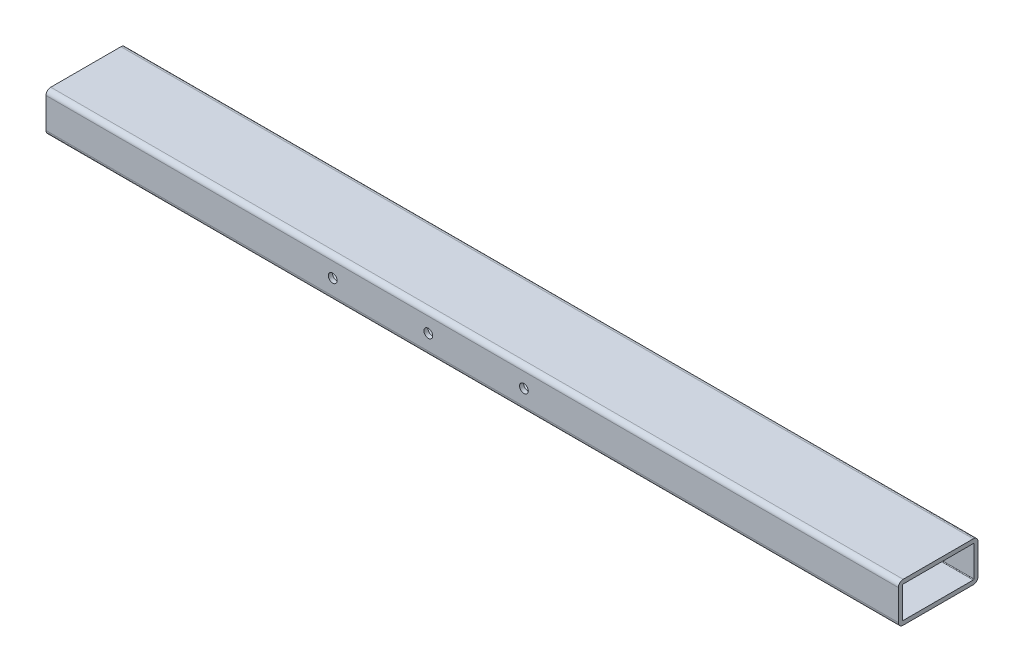
ISO-10303-21;
HEADER;
FILE_DESCRIPTION(('STEP AP214'),'2;1');
FILE_NAME('part.step','',(''),(''),'','','');
FILE_SCHEMA(('AUTOMOTIVE_DESIGN { 1 0 10303 214 1 1 1 1 }'));
ENDSEC;
DATA;
#1=APPLICATION_CONTEXT('core data for automotive mechanical design processes');
#2=APPLICATION_PROTOCOL_DEFINITION('international standard','automotive_design',2000,#1);
#3=PRODUCT_CONTEXT('',#1,'mechanical');
#4=PRODUCT('Part','Part','',(#3));
#5=PRODUCT_RELATED_PRODUCT_CATEGORY('part','',(#4));
#6=PRODUCT_DEFINITION_FORMATION('','',#4);
#7=PRODUCT_DEFINITION_CONTEXT('part definition',#1,'design');
#8=PRODUCT_DEFINITION('design','',#6,#7);
#9=PRODUCT_DEFINITION_SHAPE('','',#8);
#10=(LENGTH_UNIT() NAMED_UNIT(*) SI_UNIT(.MILLI.,.METRE.));
#11=(NAMED_UNIT(*) PLANE_ANGLE_UNIT() SI_UNIT($,.RADIAN.));
#12=(NAMED_UNIT(*) SI_UNIT($,.STERADIAN.) SOLID_ANGLE_UNIT());
#13=UNCERTAINTY_MEASURE_WITH_UNIT(LENGTH_MEASURE(1.E-05),#10,'distance_accuracy_value','');
#14=(GEOMETRIC_REPRESENTATION_CONTEXT(3) GLOBAL_UNCERTAINTY_ASSIGNED_CONTEXT((#13)) GLOBAL_UNIT_ASSIGNED_CONTEXT((#10,
#11,#12)) REPRESENTATION_CONTEXT('',''));
#15=CARTESIAN_POINT('',(0.,0.,0.));
#16=DIRECTION('',(0.,0.,1.));
#17=DIRECTION('',(1.,0.,0.));
#18=AXIS2_PLACEMENT_3D('',#15,#16,#17);
#19=CARTESIAN_POINT('',(535.,9.5,22.));
#20=DIRECTION('',(-1.,0.,0.));
#21=DIRECTION('',(0.,0.,1.));
#22=AXIS2_PLACEMENT_3D('',#19,#20,#21);
#23=CYLINDRICAL_SURFACE('',#22,3.);
#24=CARTESIAN_POINT('',(0.,9.5,22.));
#25=DIRECTION('',(1.,0.,0.));
#26=DIRECTION('',(0.,0.,-1.));
#27=AXIS2_PLACEMENT_3D('',#24,#25,#26);
#28=CIRCLE('',#27,3.);
#29=CARTESIAN_POINT('',(0.,12.5,22.));
#30=VERTEX_POINT('',#29);
#31=CARTESIAN_POINT('',(0.,9.5,25.));
#32=VERTEX_POINT('',#31);
#33=EDGE_CURVE('E242',#30,#32,#28,.T.);
#34=ORIENTED_EDGE('',*,*,#33,.T.);
#35=DIRECTION('',(-1.,0.,0.));
#36=VECTOR('',#35,1.);
#37=CARTESIAN_POINT('',(535.,9.5,25.));
#38=LINE('',#37,#36);
#39=CARTESIAN_POINT('',(535.,9.5,25.));
#40=VERTEX_POINT('',#39);
#41=EDGE_CURVE('E12',#40,#32,#38,.T.);
#42=ORIENTED_EDGE('',*,*,#41,.F.);
#43=CARTESIAN_POINT('',(535.,9.5,22.));
#44=DIRECTION('',(1.,0.,0.));
#45=DIRECTION('',(0.,0.,-1.));
#46=AXIS2_PLACEMENT_3D('',#43,#44,#45);
#47=CIRCLE('',#46,3.);
#48=CARTESIAN_POINT('',(535.,12.5,22.));
#49=VERTEX_POINT('',#48);
#50=EDGE_CURVE('E326',#49,#40,#47,.T.);
#51=ORIENTED_EDGE('',*,*,#50,.F.);
#52=DIRECTION('',(-1.,0.,0.));
#53=VECTOR('',#52,1.);
#54=CARTESIAN_POINT('',(535.,12.5,22.));
#55=LINE('',#54,#53);
#56=EDGE_CURVE('E257',#49,#30,#55,.T.);
#57=ORIENTED_EDGE('',*,*,#56,.T.);
#58=EDGE_LOOP('',(#34,#42,#51,#57));
#59=FACE_BOUND('',#58,.T.);
#60=ADVANCED_FACE('F68',(#59),#23,.T.);
#61=CARTESIAN_POINT('',(535.,9.5,25.));
#62=DIRECTION('',(0.,0.,-1.));
#63=DIRECTION('',(-1.,0.,0.));
#64=AXIS2_PLACEMENT_3D('',#61,#62,#63);
#65=PLANE('',#64);
#66=CARTESIAN_POINT('',(179.973841654525,0.200000000000009,25.));
#67=DIRECTION('',(0.,0.,-1.));
#68=DIRECTION('',(-1.,0.,0.));
#69=AXIS2_PLACEMENT_3D('',#66,#67,#68);
#70=CIRCLE('',#69,2.75000000000001);
#71=CARTESIAN_POINT('',(177.223841654525,0.200000000000009,25.));
#72=VERTEX_POINT('',#71);
#73=EDGE_CURVE('E286',#72,#72,#70,.T.);
#74=ORIENTED_EDGE('',*,*,#73,.T.);
#75=EDGE_LOOP('',(#74));
#76=FACE_BOUND('',#75,.T.);
#77=CARTESIAN_POINT('',(239.973841654525,0.200000000000006,25.));
#78=DIRECTION('',(0.,0.,-1.));
#79=DIRECTION('',(-1.,0.,0.));
#80=AXIS2_PLACEMENT_3D('',#77,#78,#79);
#81=CIRCLE('',#80,2.75000000000001);
#82=CARTESIAN_POINT('',(237.223841654525,0.200000000000006,25.));
#83=VERTEX_POINT('',#82);
#84=EDGE_CURVE('E460',#83,#83,#81,.T.);
#85=ORIENTED_EDGE('',*,*,#84,.T.);
#86=EDGE_LOOP('',(#85));
#87=FACE_BOUND('',#86,.T.);
#88=CARTESIAN_POINT('',(299.973841654525,0.199999999999997,25.));
#89=DIRECTION('',(0.,0.,-1.));
#90=DIRECTION('',(-1.,0.,0.));
#91=AXIS2_PLACEMENT_3D('',#88,#89,#90);
#92=CIRCLE('',#91,2.74999999999998);
#93=CARTESIAN_POINT('',(297.223841654525,0.199999999999997,25.));
#94=VERTEX_POINT('',#93);
#95=EDGE_CURVE('E299',#94,#94,#92,.T.);
#96=ORIENTED_EDGE('',*,*,#95,.T.);
#97=EDGE_LOOP('',(#96));
#98=FACE_BOUND('',#97,.T.);
#99=DIRECTION('',(0.,-1.,0.));
#100=VECTOR('',#99,1.);
#101=CARTESIAN_POINT('',(0.,9.5,25.));
#102=LINE('',#101,#100);
#103=CARTESIAN_POINT('',(0.,-9.5,25.));
#104=VERTEX_POINT('',#103);
#105=EDGE_CURVE('E245',#32,#104,#102,.T.);
#106=ORIENTED_EDGE('',*,*,#105,.T.);
#107=DIRECTION('',(-1.,0.,0.));
#108=VECTOR('',#107,1.);
#109=CARTESIAN_POINT('',(535.,-9.5,25.));
#110=LINE('',#109,#108);
#111=CARTESIAN_POINT('',(535.,-9.5,25.));
#112=VERTEX_POINT('',#111);
#113=EDGE_CURVE('E78',#112,#104,#110,.T.);
#114=ORIENTED_EDGE('',*,*,#113,.F.);
#115=DIRECTION('',(0.,-1.,0.));
#116=VECTOR('',#115,1.);
#117=CARTESIAN_POINT('',(535.,9.5,25.));
#118=LINE('',#117,#116);
#119=EDGE_CURVE('E328',#40,#112,#118,.T.);
#120=ORIENTED_EDGE('',*,*,#119,.F.);
#121=ORIENTED_EDGE('',*,*,#41,.T.);
#122=EDGE_LOOP('',(#106,#114,#120,#121));
#123=FACE_BOUND('',#122,.T.);
#124=ADVANCED_FACE('F366',(#76,#87,#98,#123),#65,.F.);
#125=CARTESIAN_POINT('',(535.,-9.5,22.));
#126=DIRECTION('',(-1.,0.,0.));
#127=DIRECTION('',(0.,0.,1.));
#128=AXIS2_PLACEMENT_3D('',#125,#126,#127);
#129=CYLINDRICAL_SURFACE('',#128,3.);
#130=CARTESIAN_POINT('',(0.,-9.5,22.));
#131=DIRECTION('',(1.,0.,0.));
#132=DIRECTION('',(0.,0.,-1.));
#133=AXIS2_PLACEMENT_3D('',#130,#131,#132);
#134=CIRCLE('',#133,3.);
#135=CARTESIAN_POINT('',(0.,-12.5,22.));
#136=VERTEX_POINT('',#135);
#137=EDGE_CURVE('E247',#104,#136,#134,.T.);
#138=ORIENTED_EDGE('',*,*,#137,.T.);
#139=DIRECTION('',(-1.,0.,0.));
#140=VECTOR('',#139,1.);
#141=CARTESIAN_POINT('',(535.,-12.5,22.));
#142=LINE('',#141,#140);
#143=CARTESIAN_POINT('',(535.,-12.5,22.));
#144=VERTEX_POINT('',#143);
#145=EDGE_CURVE('E264',#144,#136,#142,.T.);
#146=ORIENTED_EDGE('',*,*,#145,.F.);
#147=CARTESIAN_POINT('',(535.,-9.5,22.));
#148=DIRECTION('',(1.,0.,0.));
#149=DIRECTION('',(0.,0.,-1.));
#150=AXIS2_PLACEMENT_3D('',#147,#148,#149);
#151=CIRCLE('',#150,3.);
#152=EDGE_CURVE('E330',#112,#144,#151,.T.);
#153=ORIENTED_EDGE('',*,*,#152,.F.);
#154=ORIENTED_EDGE('',*,*,#113,.T.);
#155=EDGE_LOOP('',(#138,#146,#153,#154));
#156=FACE_BOUND('',#155,.T.);
#157=ADVANCED_FACE('F371',(#156),#129,.T.);
#158=CARTESIAN_POINT('',(535.,-12.5,-22.));
#159=DIRECTION('',(0.,1.,0.));
#160=DIRECTION('',(0.,0.,1.));
#161=AXIS2_PLACEMENT_3D('',#158,#159,#160);
#162=PLANE('',#161);
#163=DIRECTION('',(0.,0.,-1.));
#164=VECTOR('',#163,1.);
#165=CARTESIAN_POINT('',(0.,-12.5,-22.));
#166=LINE('',#165,#164);
#167=CARTESIAN_POINT('',(0.,-12.5,-22.));
#168=VERTEX_POINT('',#167);
#169=EDGE_CURVE('E249',#136,#168,#166,.T.);
#170=ORIENTED_EDGE('',*,*,#169,.T.);
#171=DIRECTION('',(-1.,0.,0.));
#172=VECTOR('',#171,1.);
#173=CARTESIAN_POINT('',(535.,-12.5,-22.));
#174=LINE('',#173,#172);
#175=CARTESIAN_POINT('',(535.,-12.5,-22.));
#176=VERTEX_POINT('',#175);
#177=EDGE_CURVE('E261',#176,#168,#174,.T.);
#178=ORIENTED_EDGE('',*,*,#177,.F.);
#179=DIRECTION('',(0.,0.,-1.));
#180=VECTOR('',#179,1.);
#181=CARTESIAN_POINT('',(535.,-12.5,-22.));
#182=LINE('',#181,#180);
#183=EDGE_CURVE('E332',#144,#176,#182,.T.);
#184=ORIENTED_EDGE('',*,*,#183,.F.);
#185=ORIENTED_EDGE('',*,*,#145,.T.);
#186=EDGE_LOOP('',(#170,#178,#184,#185));
#187=FACE_BOUND('',#186,.T.);
#188=ADVANCED_FACE('F338',(#187),#162,.F.);
#189=CARTESIAN_POINT('',(535.,-9.5,-22.));
#190=DIRECTION('',(-1.,0.,0.));
#191=DIRECTION('',(0.,0.,1.));
#192=AXIS2_PLACEMENT_3D('',#189,#190,#191);
#193=CYLINDRICAL_SURFACE('',#192,3.);
#194=CARTESIAN_POINT('',(0.,-9.5,-22.));
#195=DIRECTION('',(1.,0.,0.));
#196=DIRECTION('',(0.,0.,-1.));
#197=AXIS2_PLACEMENT_3D('',#194,#195,#196);
#198=CIRCLE('',#197,3.);
#199=CARTESIAN_POINT('',(0.,-9.5,-25.));
#200=VERTEX_POINT('',#199);
#201=EDGE_CURVE('E251',#168,#200,#198,.T.);
#202=ORIENTED_EDGE('',*,*,#201,.T.);
#203=DIRECTION('',(-1.,0.,0.));
#204=VECTOR('',#203,1.);
#205=CARTESIAN_POINT('',(535.,-9.5,-25.));
#206=LINE('',#205,#204);
#207=CARTESIAN_POINT('',(535.,-9.5,-25.));
#208=VERTEX_POINT('',#207);
#209=EDGE_CURVE('E208',#208,#200,#206,.T.);
#210=ORIENTED_EDGE('',*,*,#209,.F.);
#211=CARTESIAN_POINT('',(535.,-9.5,-22.));
#212=DIRECTION('',(1.,0.,0.));
#213=DIRECTION('',(0.,0.,-1.));
#214=AXIS2_PLACEMENT_3D('',#211,#212,#213);
#215=CIRCLE('',#214,3.);
#216=EDGE_CURVE('E199',#176,#208,#215,.T.);
#217=ORIENTED_EDGE('',*,*,#216,.F.);
#218=ORIENTED_EDGE('',*,*,#177,.T.);
#219=EDGE_LOOP('',(#202,#210,#217,#218));
#220=FACE_BOUND('',#219,.T.);
#221=ADVANCED_FACE('F342',(#220),#193,.T.);
#222=CARTESIAN_POINT('',(535.,-9.5,-25.));
#223=DIRECTION('',(0.,0.,1.));
#224=DIRECTION('',(1.,0.,0.));
#225=AXIS2_PLACEMENT_3D('',#222,#223,#224);
#226=PLANE('',#225);
#227=CARTESIAN_POINT('',(179.973841654525,0.200000000000009,-25.));
#228=DIRECTION('',(0.,0.,-1.));
#229=DIRECTION('',(-1.,0.,0.));
#230=AXIS2_PLACEMENT_3D('',#227,#228,#229);
#231=CIRCLE('',#230,2.75000000000001);
#232=CARTESIAN_POINT('',(177.223841654525,0.200000000000009,-25.));
#233=VERTEX_POINT('',#232);
#234=EDGE_CURVE('E452',#233,#233,#231,.T.);
#235=ORIENTED_EDGE('',*,*,#234,.F.);
#236=EDGE_LOOP('',(#235));
#237=FACE_BOUND('',#236,.T.);
#238=CARTESIAN_POINT('',(239.973841654525,0.200000000000006,-25.));
#239=DIRECTION('',(0.,0.,-1.));
#240=DIRECTION('',(-1.,0.,0.));
#241=AXIS2_PLACEMENT_3D('',#238,#239,#240);
#242=CIRCLE('',#241,2.75000000000001);
#243=CARTESIAN_POINT('',(237.223841654525,0.200000000000006,-25.));
#244=VERTEX_POINT('',#243);
#245=EDGE_CURVE('E455',#244,#244,#242,.T.);
#246=ORIENTED_EDGE('',*,*,#245,.F.);
#247=EDGE_LOOP('',(#246));
#248=FACE_BOUND('',#247,.T.);
#249=CARTESIAN_POINT('',(299.973841654525,0.199999999999997,-25.));
#250=DIRECTION('',(0.,0.,-1.));
#251=DIRECTION('',(-1.,0.,0.));
#252=AXIS2_PLACEMENT_3D('',#249,#250,#251);
#253=CIRCLE('',#252,2.74999999999998);
#254=CARTESIAN_POINT('',(297.223841654525,0.199999999999997,-25.));
#255=VERTEX_POINT('',#254);
#256=EDGE_CURVE('E462',#255,#255,#253,.T.);
#257=ORIENTED_EDGE('',*,*,#256,.F.);
#258=EDGE_LOOP('',(#257));
#259=FACE_BOUND('',#258,.T.);
#260=DIRECTION('',(0.,1.,0.));
#261=VECTOR('',#260,1.);
#262=CARTESIAN_POINT('',(0.,-9.5,-25.));
#263=LINE('',#262,#261);
#264=CARTESIAN_POINT('',(0.,9.5,-25.));
#265=VERTEX_POINT('',#264);
#266=EDGE_CURVE('E207',#200,#265,#263,.T.);
#267=ORIENTED_EDGE('',*,*,#266,.T.);
#268=DIRECTION('',(-1.,0.,0.));
#269=VECTOR('',#268,1.);
#270=CARTESIAN_POINT('',(535.,9.5,-25.));
#271=LINE('',#270,#269);
#272=CARTESIAN_POINT('',(535.,9.5,-25.));
#273=VERTEX_POINT('',#272);
#274=EDGE_CURVE('E204',#273,#265,#271,.T.);
#275=ORIENTED_EDGE('',*,*,#274,.F.);
#276=DIRECTION('',(0.,1.,0.));
#277=VECTOR('',#276,1.);
#278=CARTESIAN_POINT('',(535.,-9.5,-25.));
#279=LINE('',#278,#277);
#280=EDGE_CURVE('E193',#208,#273,#279,.T.);
#281=ORIENTED_EDGE('',*,*,#280,.F.);
#282=ORIENTED_EDGE('',*,*,#209,.T.);
#283=EDGE_LOOP('',(#267,#275,#281,#282));
#284=FACE_BOUND('',#283,.T.);
#285=ADVANCED_FACE('F205',(#237,#248,#259,#284),#226,.F.);
#286=CARTESIAN_POINT('',(535.,9.5,-22.));
#287=DIRECTION('',(-1.,0.,0.));
#288=DIRECTION('',(0.,0.,1.));
#289=AXIS2_PLACEMENT_3D('',#286,#287,#288);
#290=CYLINDRICAL_SURFACE('',#289,3.);
#291=CARTESIAN_POINT('',(0.,9.5,-22.));
#292=DIRECTION('',(1.,0.,0.));
#293=DIRECTION('',(0.,0.,-1.));
#294=AXIS2_PLACEMENT_3D('',#291,#292,#293);
#295=CIRCLE('',#294,3.);
#296=CARTESIAN_POINT('',(0.,12.5,-22.));
#297=VERTEX_POINT('',#296);
#298=EDGE_CURVE('E140',#265,#297,#295,.T.);
#299=ORIENTED_EDGE('',*,*,#298,.T.);
#300=DIRECTION('',(-1.,0.,0.));
#301=VECTOR('',#300,1.);
#302=CARTESIAN_POINT('',(535.,12.5,-22.));
#303=LINE('',#302,#301);
#304=CARTESIAN_POINT('',(535.,12.5,-22.));
#305=VERTEX_POINT('',#304);
#306=EDGE_CURVE('E209',#305,#297,#303,.T.);
#307=ORIENTED_EDGE('',*,*,#306,.F.);
#308=CARTESIAN_POINT('',(535.,9.5,-22.));
#309=DIRECTION('',(1.,0.,0.));
#310=DIRECTION('',(0.,0.,-1.));
#311=AXIS2_PLACEMENT_3D('',#308,#309,#310);
#312=CIRCLE('',#311,3.);
#313=EDGE_CURVE('E197',#273,#305,#312,.T.);
#314=ORIENTED_EDGE('',*,*,#313,.F.);
#315=ORIENTED_EDGE('',*,*,#274,.T.);
#316=EDGE_LOOP('',(#299,#307,#314,#315));
#317=FACE_BOUND('',#316,.T.);
#318=ADVANCED_FACE('F211',(#317),#290,.T.);
#319=CARTESIAN_POINT('',(535.,-9.5,22.));
#320=DIRECTION('',(-1.,0.,0.));
#321=DIRECTION('',(0.,0.,1.));
#322=AXIS2_PLACEMENT_3D('',#319,#320,#321);
#323=CYLINDRICAL_SURFACE('',#322,0.4);
#324=CARTESIAN_POINT('',(0.,-9.5,22.));
#325=DIRECTION('',(1.,0.,0.));
#326=DIRECTION('',(0.,0.,-1.));
#327=AXIS2_PLACEMENT_3D('',#324,#325,#326);
#328=CIRCLE('',#327,0.4);
#329=CARTESIAN_POINT('',(0.,-9.5,22.4));
#330=VERTEX_POINT('',#329);
#331=CARTESIAN_POINT('',(0.,-9.9,22.));
#332=VERTEX_POINT('',#331);
#333=EDGE_CURVE('E217',#330,#332,#328,.T.);
#334=ORIENTED_EDGE('',*,*,#333,.F.);
#335=DIRECTION('',(-1.,0.,0.));
#336=VECTOR('',#335,1.);
#337=CARTESIAN_POINT('',(535.,-9.5,22.4));
#338=LINE('',#337,#336);
#339=CARTESIAN_POINT('',(535.,-9.5,22.4));
#340=VERTEX_POINT('',#339);
#341=EDGE_CURVE('E154',#340,#330,#338,.T.);
#342=ORIENTED_EDGE('',*,*,#341,.F.);
#343=CARTESIAN_POINT('',(535.,-9.5,22.));
#344=DIRECTION('',(1.,0.,0.));
#345=DIRECTION('',(0.,0.,-1.));
#346=AXIS2_PLACEMENT_3D('',#343,#344,#345);
#347=CIRCLE('',#346,0.4);
#348=CARTESIAN_POINT('',(535.,-9.9,22.));
#349=VERTEX_POINT('',#348);
#350=EDGE_CURVE('E256',#340,#349,#347,.T.);
#351=ORIENTED_EDGE('',*,*,#350,.T.);
#352=DIRECTION('',(-1.,0.,0.));
#353=VECTOR('',#352,1.);
#354=CARTESIAN_POINT('',(535.,-9.9,22.));
#355=LINE('',#354,#353);
#356=EDGE_CURVE('E213',#349,#332,#355,.T.);
#357=ORIENTED_EDGE('',*,*,#356,.T.);
#358=EDGE_LOOP('',(#334,#342,#351,#357));
#359=FACE_BOUND('',#358,.T.);
#360=ADVANCED_FACE('F70',(#359),#323,.F.);
#361=CARTESIAN_POINT('',(535.,9.5,22.4));
#362=DIRECTION('',(0.,0.,-1.));
#363=DIRECTION('',(-1.,0.,0.));
#364=AXIS2_PLACEMENT_3D('',#361,#362,#363);
#365=PLANE('',#364);
#366=CARTESIAN_POINT('',(179.973841654525,0.200000000000009,22.4));
#367=DIRECTION('',(0.,0.,-1.));
#368=DIRECTION('',(-1.,0.,0.));
#369=AXIS2_PLACEMENT_3D('',#366,#367,#368);
#370=CIRCLE('',#369,2.75000000000001);
#371=CARTESIAN_POINT('',(177.223841654525,0.200000000000009,22.4));
#372=VERTEX_POINT('',#371);
#373=EDGE_CURVE('E221',#372,#372,#370,.T.);
#374=ORIENTED_EDGE('',*,*,#373,.F.);
#375=EDGE_LOOP('',(#374));
#376=FACE_BOUND('',#375,.T.);
#377=CARTESIAN_POINT('',(239.973841654525,0.200000000000006,22.4));
#378=DIRECTION('',(0.,0.,-1.));
#379=DIRECTION('',(-1.,0.,0.));
#380=AXIS2_PLACEMENT_3D('',#377,#378,#379);
#381=CIRCLE('',#380,2.75000000000001);
#382=CARTESIAN_POINT('',(237.223841654525,0.200000000000006,22.4));
#383=VERTEX_POINT('',#382);
#384=EDGE_CURVE('E289',#383,#383,#381,.T.);
#385=ORIENTED_EDGE('',*,*,#384,.F.);
#386=EDGE_LOOP('',(#385));
#387=FACE_BOUND('',#386,.T.);
#388=CARTESIAN_POINT('',(299.973841654525,0.199999999999997,22.4));
#389=DIRECTION('',(0.,0.,-1.));
#390=DIRECTION('',(-1.,0.,0.));
#391=AXIS2_PLACEMENT_3D('',#388,#389,#390);
#392=CIRCLE('',#391,2.74999999999998);
#393=CARTESIAN_POINT('',(297.223841654525,0.199999999999997,22.4));
#394=VERTEX_POINT('',#393);
#395=EDGE_CURVE('E285',#394,#394,#392,.T.);
#396=ORIENTED_EDGE('',*,*,#395,.F.);
#397=EDGE_LOOP('',(#396));
#398=FACE_BOUND('',#397,.T.);
#399=DIRECTION('',(0.,-1.,0.));
#400=VECTOR('',#399,1.);
#401=CARTESIAN_POINT('',(0.,9.5,22.4));
#402=LINE('',#401,#400);
#403=CARTESIAN_POINT('',(0.,9.5,22.4));
#404=VERTEX_POINT('',#403);
#405=EDGE_CURVE('E220',#404,#330,#402,.T.);
#406=ORIENTED_EDGE('',*,*,#405,.F.);
#407=DIRECTION('',(-1.,0.,0.));
#408=VECTOR('',#407,1.);
#409=CARTESIAN_POINT('',(535.,9.5,22.4));
#410=LINE('',#409,#408);
#411=CARTESIAN_POINT('',(535.,9.5,22.4));
#412=VERTEX_POINT('',#411);
#413=EDGE_CURVE('E280',#412,#404,#410,.T.);
#414=ORIENTED_EDGE('',*,*,#413,.F.);
#415=DIRECTION('',(0.,-1.,0.));
#416=VECTOR('',#415,1.);
#417=CARTESIAN_POINT('',(535.,9.5,22.4));
#418=LINE('',#417,#416);
#419=EDGE_CURVE('E305',#412,#340,#418,.T.);
#420=ORIENTED_EDGE('',*,*,#419,.T.);
#421=ORIENTED_EDGE('',*,*,#341,.T.);
#422=EDGE_LOOP('',(#406,#414,#420,#421));
#423=FACE_BOUND('',#422,.T.);
#424=ADVANCED_FACE('F393',(#376,#387,#398,#423),#365,.T.);
#425=CARTESIAN_POINT('',(535.,9.5,22.));
#426=DIRECTION('',(-1.,0.,0.));
#427=DIRECTION('',(0.,0.,1.));
#428=AXIS2_PLACEMENT_3D('',#425,#426,#427);
#429=CYLINDRICAL_SURFACE('',#428,0.4);
#430=CARTESIAN_POINT('',(0.,9.5,22.));
#431=DIRECTION('',(1.,0.,0.));
#432=DIRECTION('',(0.,0.,-1.));
#433=AXIS2_PLACEMENT_3D('',#430,#431,#432);
#434=CIRCLE('',#433,0.4);
#435=CARTESIAN_POINT('',(0.,9.9,22.));
#436=VERTEX_POINT('',#435);
#437=EDGE_CURVE('E224',#436,#404,#434,.T.);
#438=ORIENTED_EDGE('',*,*,#437,.F.);
#439=DIRECTION('',(-1.,0.,0.));
#440=VECTOR('',#439,1.);
#441=CARTESIAN_POINT('',(535.,9.9,22.));
#442=LINE('',#441,#440);
#443=CARTESIAN_POINT('',(535.,9.9,22.));
#444=VERTEX_POINT('',#443);
#445=EDGE_CURVE('E278',#444,#436,#442,.T.);
#446=ORIENTED_EDGE('',*,*,#445,.F.);
#447=CARTESIAN_POINT('',(535.,9.5,22.));
#448=DIRECTION('',(1.,0.,0.));
#449=DIRECTION('',(0.,0.,-1.));
#450=AXIS2_PLACEMENT_3D('',#447,#448,#449);
#451=CIRCLE('',#450,0.4);
#452=EDGE_CURVE('E308',#444,#412,#451,.T.);
#453=ORIENTED_EDGE('',*,*,#452,.T.);
#454=ORIENTED_EDGE('',*,*,#413,.T.);
#455=EDGE_LOOP('',(#438,#446,#453,#454));
#456=FACE_BOUND('',#455,.T.);
#457=ADVANCED_FACE('F390',(#456),#429,.F.);
#458=CARTESIAN_POINT('',(535.,9.9,22.));
#459=DIRECTION('',(0.,-1.,0.));
#460=DIRECTION('',(0.,0.,-1.));
#461=AXIS2_PLACEMENT_3D('',#458,#459,#460);
#462=PLANE('',#461);
#463=DIRECTION('',(0.,0.,1.));
#464=VECTOR('',#463,1.);
#465=CARTESIAN_POINT('',(0.,9.9,22.));
#466=LINE('',#465,#464);
#467=CARTESIAN_POINT('',(0.,9.9,-22.));
#468=VERTEX_POINT('',#467);
#469=EDGE_CURVE('E227',#468,#436,#466,.T.);
#470=ORIENTED_EDGE('',*,*,#469,.F.);
#471=DIRECTION('',(-1.,0.,0.));
#472=VECTOR('',#471,1.);
#473=CARTESIAN_POINT('',(535.,9.9,-22.));
#474=LINE('',#473,#472);
#475=CARTESIAN_POINT('',(535.,9.9,-22.));
#476=VERTEX_POINT('',#475);
#477=EDGE_CURVE('E276',#476,#468,#474,.T.);
#478=ORIENTED_EDGE('',*,*,#477,.F.);
#479=DIRECTION('',(0.,0.,1.));
#480=VECTOR('',#479,1.);
#481=CARTESIAN_POINT('',(535.,9.9,22.));
#482=LINE('',#481,#480);
#483=EDGE_CURVE('E311',#476,#444,#482,.T.);
#484=ORIENTED_EDGE('',*,*,#483,.T.);
#485=ORIENTED_EDGE('',*,*,#445,.T.);
#486=EDGE_LOOP('',(#470,#478,#484,#485));
#487=FACE_BOUND('',#486,.T.);
#488=ADVANCED_FACE('F386',(#487),#462,.T.);
#489=CARTESIAN_POINT('',(535.,9.5,-22.));
#490=DIRECTION('',(-1.,0.,0.));
#491=DIRECTION('',(0.,0.,1.));
#492=AXIS2_PLACEMENT_3D('',#489,#490,#491);
#493=CYLINDRICAL_SURFACE('',#492,0.4);
#494=CARTESIAN_POINT('',(0.,9.5,-22.));
#495=DIRECTION('',(1.,0.,0.));
#496=DIRECTION('',(0.,0.,-1.));
#497=AXIS2_PLACEMENT_3D('',#494,#495,#496);
#498=CIRCLE('',#497,0.4);
#499=CARTESIAN_POINT('',(0.,9.5,-22.4));
#500=VERTEX_POINT('',#499);
#501=EDGE_CURVE('E230',#500,#468,#498,.T.);
#502=ORIENTED_EDGE('',*,*,#501,.F.);
#503=DIRECTION('',(-1.,0.,0.));
#504=VECTOR('',#503,1.);
#505=CARTESIAN_POINT('',(535.,9.5,-22.4));
#506=LINE('',#505,#504);
#507=CARTESIAN_POINT('',(535.,9.5,-22.4));
#508=VERTEX_POINT('',#507);
#509=EDGE_CURVE('E274',#508,#500,#506,.T.);
#510=ORIENTED_EDGE('',*,*,#509,.F.);
#511=CARTESIAN_POINT('',(535.,9.5,-22.));
#512=DIRECTION('',(1.,0.,0.));
#513=DIRECTION('',(0.,0.,-1.));
#514=AXIS2_PLACEMENT_3D('',#511,#512,#513);
#515=CIRCLE('',#514,0.4);
#516=EDGE_CURVE('E314',#508,#476,#515,.T.);
#517=ORIENTED_EDGE('',*,*,#516,.T.);
#518=ORIENTED_EDGE('',*,*,#477,.T.);
#519=EDGE_LOOP('',(#502,#510,#517,#518));
#520=FACE_BOUND('',#519,.T.);
#521=ADVANCED_FACE('F382',(#520),#493,.F.);
#522=CARTESIAN_POINT('',(535.,-9.5,-22.4));
#523=DIRECTION('',(0.,0.,1.));
#524=DIRECTION('',(1.,0.,0.));
#525=AXIS2_PLACEMENT_3D('',#522,#523,#524);
#526=PLANE('',#525);
#527=CARTESIAN_POINT('',(179.973841654525,0.200000000000009,-22.4));
#528=DIRECTION('',(0.,0.,1.));
#529=DIRECTION('',(1.,0.,0.));
#530=AXIS2_PLACEMENT_3D('',#527,#528,#529);
#531=CIRCLE('',#530,2.75000000000001);
#532=CARTESIAN_POINT('',(182.723841654525,0.200000000000009,-22.4));
#533=VERTEX_POINT('',#532);
#534=EDGE_CURVE('E72',#533,#533,#531,.T.);
#535=ORIENTED_EDGE('',*,*,#534,.F.);
#536=EDGE_LOOP('',(#535));
#537=FACE_BOUND('',#536,.T.);
#538=CARTESIAN_POINT('',(239.973841654525,0.200000000000006,-22.4));
#539=DIRECTION('',(0.,0.,1.));
#540=DIRECTION('',(1.,0.,0.));
#541=AXIS2_PLACEMENT_3D('',#538,#539,#540);
#542=CIRCLE('',#541,2.75000000000001);
#543=CARTESIAN_POINT('',(242.723841654525,0.200000000000006,-22.4));
#544=VERTEX_POINT('',#543);
#545=EDGE_CURVE('E287',#544,#544,#542,.T.);
#546=ORIENTED_EDGE('',*,*,#545,.F.);
#547=EDGE_LOOP('',(#546));
#548=FACE_BOUND('',#547,.T.);
#549=CARTESIAN_POINT('',(299.973841654525,0.199999999999997,-22.4));
#550=DIRECTION('',(0.,0.,1.));
#551=DIRECTION('',(1.,0.,0.));
#552=AXIS2_PLACEMENT_3D('',#549,#550,#551);
#553=CIRCLE('',#552,2.74999999999998);
#554=CARTESIAN_POINT('',(302.723841654525,0.199999999999997,-22.4));
#555=VERTEX_POINT('',#554);
#556=EDGE_CURVE('E283',#555,#555,#553,.T.);
#557=ORIENTED_EDGE('',*,*,#556,.F.);
#558=EDGE_LOOP('',(#557));
#559=FACE_BOUND('',#558,.T.);
#560=DIRECTION('',(0.,1.,0.));
#561=VECTOR('',#560,1.);
#562=CARTESIAN_POINT('',(0.,-9.5,-22.4));
#563=LINE('',#562,#561);
#564=CARTESIAN_POINT('',(0.,-9.5,-22.4));
#565=VERTEX_POINT('',#564);
#566=EDGE_CURVE('E233',#565,#500,#563,.T.);
#567=ORIENTED_EDGE('',*,*,#566,.F.);
#568=DIRECTION('',(-1.,0.,0.));
#569=VECTOR('',#568,1.);
#570=CARTESIAN_POINT('',(535.,-9.5,-22.4));
#571=LINE('',#570,#569);
#572=CARTESIAN_POINT('',(535.,-9.5,-22.4));
#573=VERTEX_POINT('',#572);
#574=EDGE_CURVE('E272',#573,#565,#571,.T.);
#575=ORIENTED_EDGE('',*,*,#574,.F.);
#576=DIRECTION('',(0.,1.,0.));
#577=VECTOR('',#576,1.);
#578=CARTESIAN_POINT('',(535.,-9.5,-22.4));
#579=LINE('',#578,#577);
#580=EDGE_CURVE('E317',#573,#508,#579,.T.);
#581=ORIENTED_EDGE('',*,*,#580,.T.);
#582=ORIENTED_EDGE('',*,*,#509,.T.);
#583=EDGE_LOOP('',(#567,#575,#581,#582));
#584=FACE_BOUND('',#583,.T.);
#585=ADVANCED_FACE('F378',(#537,#548,#559,#584),#526,.T.);
#586=CARTESIAN_POINT('',(535.,-9.5,-22.));
#587=DIRECTION('',(-1.,0.,0.));
#588=DIRECTION('',(0.,0.,1.));
#589=AXIS2_PLACEMENT_3D('',#586,#587,#588);
#590=CYLINDRICAL_SURFACE('',#589,0.4);
#591=CARTESIAN_POINT('',(0.,-9.5,-22.));
#592=DIRECTION('',(1.,0.,0.));
#593=DIRECTION('',(0.,0.,-1.));
#594=AXIS2_PLACEMENT_3D('',#591,#592,#593);
#595=CIRCLE('',#594,0.4);
#596=CARTESIAN_POINT('',(0.,-9.9,-22.));
#597=VERTEX_POINT('',#596);
#598=EDGE_CURVE('E236',#597,#565,#595,.T.);
#599=ORIENTED_EDGE('',*,*,#598,.F.);
#600=DIRECTION('',(-1.,0.,0.));
#601=VECTOR('',#600,1.);
#602=CARTESIAN_POINT('',(535.,-9.9,-22.));
#603=LINE('',#602,#601);
#604=CARTESIAN_POINT('',(535.,-9.9,-22.));
#605=VERTEX_POINT('',#604);
#606=EDGE_CURVE('E270',#605,#597,#603,.T.);
#607=ORIENTED_EDGE('',*,*,#606,.F.);
#608=CARTESIAN_POINT('',(535.,-9.5,-22.));
#609=DIRECTION('',(1.,0.,0.));
#610=DIRECTION('',(0.,0.,-1.));
#611=AXIS2_PLACEMENT_3D('',#608,#609,#610);
#612=CIRCLE('',#611,0.4);
#613=EDGE_CURVE('E320',#605,#573,#612,.T.);
#614=ORIENTED_EDGE('',*,*,#613,.T.);
#615=ORIENTED_EDGE('',*,*,#574,.T.);
#616=EDGE_LOOP('',(#599,#607,#614,#615));
#617=FACE_BOUND('',#616,.T.);
#618=ADVANCED_FACE('F360',(#617),#590,.F.);
#619=CARTESIAN_POINT('',(535.,-9.9,-22.));
#620=DIRECTION('',(0.,1.,0.));
#621=DIRECTION('',(0.,0.,1.));
#622=AXIS2_PLACEMENT_3D('',#619,#620,#621);
#623=PLANE('',#622);
#624=DIRECTION('',(0.,0.,-1.));
#625=VECTOR('',#624,1.);
#626=CARTESIAN_POINT('',(0.,-9.9,-22.));
#627=LINE('',#626,#625);
#628=EDGE_CURVE('E239',#332,#597,#627,.T.);
#629=ORIENTED_EDGE('',*,*,#628,.F.);
#630=ORIENTED_EDGE('',*,*,#356,.F.);
#631=DIRECTION('',(0.,0.,-1.));
#632=VECTOR('',#631,1.);
#633=CARTESIAN_POINT('',(535.,-9.9,-22.));
#634=LINE('',#633,#632);
#635=EDGE_CURVE('E323',#349,#605,#634,.T.);
#636=ORIENTED_EDGE('',*,*,#635,.T.);
#637=ORIENTED_EDGE('',*,*,#606,.T.);
#638=EDGE_LOOP('',(#629,#630,#636,#637));
#639=FACE_BOUND('',#638,.T.);
#640=ADVANCED_FACE('F352',(#639),#623,.T.);
#641=CARTESIAN_POINT('',(535.,12.5,22.));
#642=DIRECTION('',(0.,-1.,0.));
#643=DIRECTION('',(0.,0.,-1.));
#644=AXIS2_PLACEMENT_3D('',#641,#642,#643);
#645=PLANE('',#644);
#646=DIRECTION('',(0.,0.,1.));
#647=VECTOR('',#646,1.);
#648=CARTESIAN_POINT('',(0.,12.5,22.));
#649=LINE('',#648,#647);
#650=EDGE_CURVE('E146',#297,#30,#649,.T.);
#651=ORIENTED_EDGE('',*,*,#650,.T.);
#652=ORIENTED_EDGE('',*,*,#56,.F.);
#653=DIRECTION('',(0.,0.,1.));
#654=VECTOR('',#653,1.);
#655=CARTESIAN_POINT('',(535.,12.5,22.));
#656=LINE('',#655,#654);
#657=EDGE_CURVE('E87',#305,#49,#656,.T.);
#658=ORIENTED_EDGE('',*,*,#657,.F.);
#659=ORIENTED_EDGE('',*,*,#306,.T.);
#660=EDGE_LOOP('',(#651,#652,#658,#659));
#661=FACE_BOUND('',#660,.T.);
#662=ADVANCED_FACE('F350',(#661),#645,.F.);
#663=CARTESIAN_POINT('',(535.,9.5,22.));
#664=DIRECTION('',(1.,0.,0.));
#665=DIRECTION('',(0.,0.,-1.));
#666=AXIS2_PLACEMENT_3D('',#663,#664,#665);
#667=PLANE('',#666);
#668=ORIENTED_EDGE('',*,*,#350,.F.);
#669=ORIENTED_EDGE('',*,*,#419,.F.);
#670=ORIENTED_EDGE('',*,*,#452,.F.);
#671=ORIENTED_EDGE('',*,*,#483,.F.);
#672=ORIENTED_EDGE('',*,*,#516,.F.);
#673=ORIENTED_EDGE('',*,*,#580,.F.);
#674=ORIENTED_EDGE('',*,*,#613,.F.);
#675=ORIENTED_EDGE('',*,*,#635,.F.);
#676=EDGE_LOOP('',(#668,#669,#670,#671,#672,#673,#674,#675));
#677=FACE_BOUND('',#676,.T.);
#678=ORIENTED_EDGE('',*,*,#50,.T.);
#679=ORIENTED_EDGE('',*,*,#119,.T.);
#680=ORIENTED_EDGE('',*,*,#152,.T.);
#681=ORIENTED_EDGE('',*,*,#183,.T.);
#682=ORIENTED_EDGE('',*,*,#216,.T.);
#683=ORIENTED_EDGE('',*,*,#280,.T.);
#684=ORIENTED_EDGE('',*,*,#313,.T.);
#685=ORIENTED_EDGE('',*,*,#657,.T.);
#686=EDGE_LOOP('',(#678,#679,#680,#681,#682,#683,#684,#685));
#687=FACE_BOUND('',#686,.T.);
#688=ADVANCED_FACE('F195',(#677,#687),#667,.T.);
#689=CARTESIAN_POINT('',(0.,9.5,22.));
#690=DIRECTION('',(1.,0.,0.));
#691=DIRECTION('',(0.,0.,-1.));
#692=AXIS2_PLACEMENT_3D('',#689,#690,#691);
#693=PLANE('',#692);
#694=ORIENTED_EDGE('',*,*,#333,.T.);
#695=ORIENTED_EDGE('',*,*,#628,.T.);
#696=ORIENTED_EDGE('',*,*,#598,.T.);
#697=ORIENTED_EDGE('',*,*,#566,.T.);
#698=ORIENTED_EDGE('',*,*,#501,.T.);
#699=ORIENTED_EDGE('',*,*,#469,.T.);
#700=ORIENTED_EDGE('',*,*,#437,.T.);
#701=ORIENTED_EDGE('',*,*,#405,.T.);
#702=EDGE_LOOP('',(#694,#695,#696,#697,#698,#699,#700,#701));
#703=FACE_BOUND('',#702,.T.);
#704=ORIENTED_EDGE('',*,*,#33,.F.);
#705=ORIENTED_EDGE('',*,*,#650,.F.);
#706=ORIENTED_EDGE('',*,*,#298,.F.);
#707=ORIENTED_EDGE('',*,*,#266,.F.);
#708=ORIENTED_EDGE('',*,*,#201,.F.);
#709=ORIENTED_EDGE('',*,*,#169,.F.);
#710=ORIENTED_EDGE('',*,*,#137,.F.);
#711=ORIENTED_EDGE('',*,*,#105,.F.);
#712=EDGE_LOOP('',(#704,#705,#706,#707,#708,#709,#710,#711));
#713=FACE_BOUND('',#712,.T.);
#714=ADVANCED_FACE('F345',(#703,#713),#693,.F.);
#715=CARTESIAN_POINT('',(299.973841654525,0.199999999999997,25.));
#716=DIRECTION('',(0.,0.,-1.));
#717=DIRECTION('',(-1.,0.,0.));
#718=AXIS2_PLACEMENT_3D('',#715,#716,#717);
#719=CYLINDRICAL_SURFACE('',#718,2.74999999999998);
#720=ORIENTED_EDGE('',*,*,#556,.T.);
#721=EDGE_LOOP('',(#720));
#722=FACE_BOUND('',#721,.T.);
#723=ORIENTED_EDGE('',*,*,#256,.T.);
#724=EDGE_LOOP('',(#723));
#725=FACE_BOUND('',#724,.T.);
#726=ADVANCED_FACE('F422',(#722,#725),#719,.F.);
#727=CARTESIAN_POINT('',(239.973841654525,0.200000000000006,25.));
#728=DIRECTION('',(0.,0.,-1.));
#729=DIRECTION('',(-1.,0.,0.));
#730=AXIS2_PLACEMENT_3D('',#727,#728,#729);
#731=CYLINDRICAL_SURFACE('',#730,2.75000000000001);
#732=ORIENTED_EDGE('',*,*,#545,.T.);
#733=EDGE_LOOP('',(#732));
#734=FACE_BOUND('',#733,.T.);
#735=ORIENTED_EDGE('',*,*,#245,.T.);
#736=EDGE_LOOP('',(#735));
#737=FACE_BOUND('',#736,.T.);
#738=ADVANCED_FACE('F426',(#734,#737),#731,.F.);
#739=CARTESIAN_POINT('',(179.973841654525,0.200000000000009,25.));
#740=DIRECTION('',(0.,0.,-1.));
#741=DIRECTION('',(-1.,0.,0.));
#742=AXIS2_PLACEMENT_3D('',#739,#740,#741);
#743=CYLINDRICAL_SURFACE('',#742,2.75000000000001);
#744=ORIENTED_EDGE('',*,*,#534,.T.);
#745=EDGE_LOOP('',(#744));
#746=FACE_BOUND('',#745,.T.);
#747=ORIENTED_EDGE('',*,*,#234,.T.);
#748=EDGE_LOOP('',(#747));
#749=FACE_BOUND('',#748,.T.);
#750=ADVANCED_FACE('F433',(#746,#749),#743,.F.);
#751=ORIENTED_EDGE('',*,*,#395,.T.);
#752=EDGE_LOOP('',(#751));
#753=FACE_BOUND('',#752,.T.);
#754=ORIENTED_EDGE('',*,*,#95,.F.);
#755=EDGE_LOOP('',(#754));
#756=FACE_BOUND('',#755,.T.);
#757=ADVANCED_FACE('F429',(#753,#756),#719,.F.);
#758=ORIENTED_EDGE('',*,*,#384,.T.);
#759=EDGE_LOOP('',(#758));
#760=FACE_BOUND('',#759,.T.);
#761=ORIENTED_EDGE('',*,*,#84,.F.);
#762=EDGE_LOOP('',(#761));
#763=FACE_BOUND('',#762,.T.);
#764=ADVANCED_FACE('F434',(#760,#763),#731,.F.);
#765=ORIENTED_EDGE('',*,*,#373,.T.);
#766=EDGE_LOOP('',(#765));
#767=FACE_BOUND('',#766,.T.);
#768=ORIENTED_EDGE('',*,*,#73,.F.);
#769=EDGE_LOOP('',(#768));
#770=FACE_BOUND('',#769,.T.);
#771=ADVANCED_FACE('F437',(#767,#770),#743,.F.);
#772=CLOSED_SHELL('',(#60,#124,#157,#188,#221,#285,#318,#360,#424,#457,#488,#521,#585,#618,#640,
#662,#688,#714,#726,#738,#750,#757,#764,#771));
#773=MANIFOLD_SOLID_BREP('B2',#772);
#774=ADVANCED_BREP_SHAPE_REPRESENTATION('',(#18,#773),#14);
#775=SHAPE_DEFINITION_REPRESENTATION(#9,#774);
ENDSEC;
END-ISO-10303-21;
